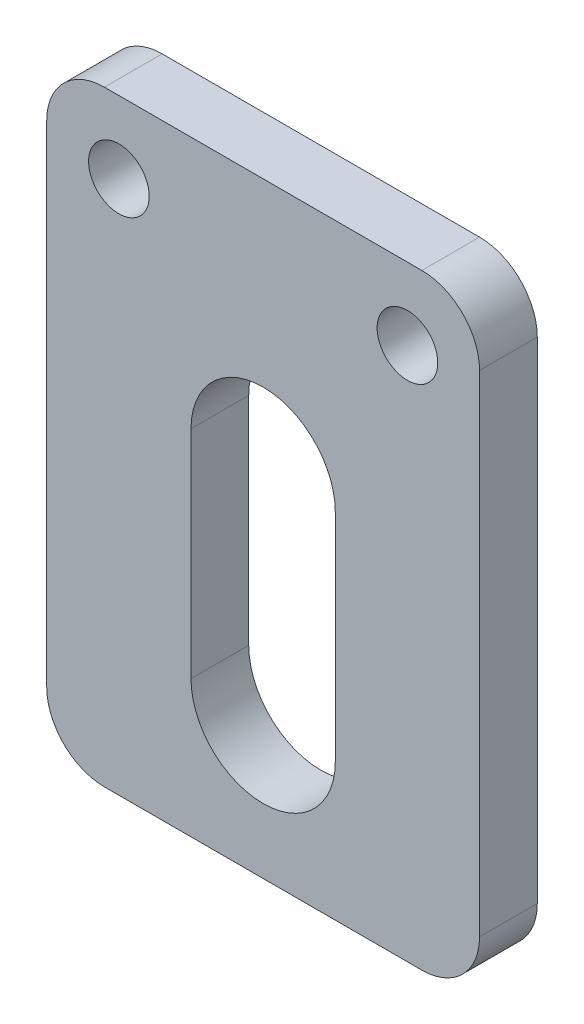
ISO-10303-21;
HEADER;
FILE_DESCRIPTION(('STEP AP214'),'2;1');
FILE_NAME('part.step','',(''),(''),'','','');
FILE_SCHEMA(('AUTOMOTIVE_DESIGN { 1 0 10303 214 1 1 1 1 }'));
ENDSEC;
DATA;
#1=APPLICATION_CONTEXT('core data for automotive mechanical design processes');
#2=APPLICATION_PROTOCOL_DEFINITION('international standard','automotive_design',2000,#1);
#3=PRODUCT_CONTEXT('',#1,'mechanical');
#4=PRODUCT('Part','Part','',(#3));
#5=PRODUCT_RELATED_PRODUCT_CATEGORY('part','',(#4));
#6=PRODUCT_DEFINITION_FORMATION('','',#4);
#7=PRODUCT_DEFINITION_CONTEXT('part definition',#1,'design');
#8=PRODUCT_DEFINITION('design','',#6,#7);
#9=PRODUCT_DEFINITION_SHAPE('','',#8);
#10=(LENGTH_UNIT() NAMED_UNIT(*) SI_UNIT(.MILLI.,.METRE.));
#11=(NAMED_UNIT(*) PLANE_ANGLE_UNIT() SI_UNIT($,.RADIAN.));
#12=(NAMED_UNIT(*) SI_UNIT($,.STERADIAN.) SOLID_ANGLE_UNIT());
#13=UNCERTAINTY_MEASURE_WITH_UNIT(LENGTH_MEASURE(1.E-05),#10,'distance_accuracy_value','');
#14=(GEOMETRIC_REPRESENTATION_CONTEXT(3) GLOBAL_UNCERTAINTY_ASSIGNED_CONTEXT((#13)) GLOBAL_UNIT_ASSIGNED_CONTEXT((#10,
#11,#12)) REPRESENTATION_CONTEXT('',''));
#15=CARTESIAN_POINT('',(0.,0.,0.));
#16=DIRECTION('',(0.,0.,1.));
#17=DIRECTION('',(1.,0.,0.));
#18=AXIS2_PLACEMENT_3D('',#15,#16,#17);
#19=CARTESIAN_POINT('',(0.,0.,4.));
#20=DIRECTION('',(1.,0.,0.));
#21=DIRECTION('',(0.,1.,0.));
#22=AXIS2_PLACEMENT_3D('',#19,#20,#21);
#23=PLANE('',#22);
#24=DIRECTION('',(0.,-1.,0.));
#25=VECTOR('',#24,1.);
#26=CARTESIAN_POINT('',(0.,0.,0.));
#27=LINE('',#26,#25);
#28=CARTESIAN_POINT('',(0.,-4.,0.));
#29=VERTEX_POINT('',#28);
#30=CARTESIAN_POINT('',(0.,-38.,0.));
#31=VERTEX_POINT('',#30);
#32=EDGE_CURVE('E184',#29,#31,#27,.T.);
#33=ORIENTED_EDGE('',*,*,#32,.T.);
#34=DIRECTION('',(0.,0.,-1.));
#35=VECTOR('',#34,1.);
#36=CARTESIAN_POINT('',(0.,-38.,4.));
#37=LINE('',#36,#35);
#38=CARTESIAN_POINT('',(0.,-38.,4.));
#39=VERTEX_POINT('',#38);
#40=EDGE_CURVE('E256',#31,#39,#37,.F.);
#41=ORIENTED_EDGE('',*,*,#40,.T.);
#42=DIRECTION('',(0.,-1.,0.));
#43=VECTOR('',#42,1.);
#44=CARTESIAN_POINT('',(0.,0.,4.));
#45=LINE('',#44,#43);
#46=CARTESIAN_POINT('',(0.,-4.,4.));
#47=VERTEX_POINT('',#46);
#48=EDGE_CURVE('E205',#47,#39,#45,.T.);
#49=ORIENTED_EDGE('',*,*,#48,.F.);
#50=DIRECTION('',(0.,0.,-1.));
#51=VECTOR('',#50,1.);
#52=CARTESIAN_POINT('',(0.,-4.,4.));
#53=LINE('',#52,#51);
#54=EDGE_CURVE('E252',#47,#29,#53,.T.);
#55=ORIENTED_EDGE('',*,*,#54,.T.);
#56=EDGE_LOOP('',(#33,#41,#49,#55));
#57=FACE_BOUND('',#56,.T.);
#58=ADVANCED_FACE('F42',(#57),#23,.F.);
#59=CARTESIAN_POINT('',(0.,-42.,4.));
#60=DIRECTION('',(0.,1.,0.));
#61=DIRECTION('',(0.,0.,1.));
#62=AXIS2_PLACEMENT_3D('',#59,#60,#61);
#63=PLANE('',#62);
#64=DIRECTION('',(1.,0.,0.));
#65=VECTOR('',#64,1.);
#66=CARTESIAN_POINT('',(0.,-42.,4.));
#67=LINE('',#66,#65);
#68=CARTESIAN_POINT('',(4.,-42.,4.));
#69=VERTEX_POINT('',#68);
#70=CARTESIAN_POINT('',(26.,-42.,4.));
#71=VERTEX_POINT('',#70);
#72=EDGE_CURVE('E209',#69,#71,#67,.T.);
#73=ORIENTED_EDGE('',*,*,#72,.F.);
#74=DIRECTION('',(0.,0.,-1.));
#75=VECTOR('',#74,1.);
#76=CARTESIAN_POINT('',(4.,-42.,4.));
#77=LINE('',#76,#75);
#78=CARTESIAN_POINT('',(4.,-42.,0.));
#79=VERTEX_POINT('',#78);
#80=EDGE_CURVE('E236',#69,#79,#77,.T.);
#81=ORIENTED_EDGE('',*,*,#80,.T.);
#82=DIRECTION('',(1.,0.,0.));
#83=VECTOR('',#82,1.);
#84=CARTESIAN_POINT('',(0.,-42.,0.));
#85=LINE('',#84,#83);
#86=CARTESIAN_POINT('',(26.,-42.,0.));
#87=VERTEX_POINT('',#86);
#88=EDGE_CURVE('E224',#79,#87,#85,.T.);
#89=ORIENTED_EDGE('',*,*,#88,.T.);
#90=DIRECTION('',(0.,0.,-1.));
#91=VECTOR('',#90,1.);
#92=CARTESIAN_POINT('',(26.,-42.,4.));
#93=LINE('',#92,#91);
#94=EDGE_CURVE('E220',#87,#71,#93,.F.);
#95=ORIENTED_EDGE('',*,*,#94,.T.);
#96=EDGE_LOOP('',(#73,#81,#89,#95));
#97=FACE_BOUND('',#96,.T.);
#98=ADVANCED_FACE('F306',(#97),#63,.F.);
#99=CARTESIAN_POINT('',(30.,0.,4.));
#100=DIRECTION('',(-1.,0.,0.));
#101=DIRECTION('',(0.,-1.,0.));
#102=AXIS2_PLACEMENT_3D('',#99,#100,#101);
#103=PLANE('',#102);
#104=DIRECTION('',(0.,1.,0.));
#105=VECTOR('',#104,1.);
#106=CARTESIAN_POINT('',(30.,0.,4.));
#107=LINE('',#106,#105);
#108=CARTESIAN_POINT('',(30.,-38.,4.));
#109=VERTEX_POINT('',#108);
#110=CARTESIAN_POINT('',(30.,-4.,4.));
#111=VERTEX_POINT('',#110);
#112=EDGE_CURVE('E214',#109,#111,#107,.T.);
#113=ORIENTED_EDGE('',*,*,#112,.F.);
#114=DIRECTION('',(0.,0.,-1.));
#115=VECTOR('',#114,1.);
#116=CARTESIAN_POINT('',(30.,-38.,4.));
#117=LINE('',#116,#115);
#118=CARTESIAN_POINT('',(30.,-38.,0.));
#119=VERTEX_POINT('',#118);
#120=EDGE_CURVE('E273',#109,#119,#117,.T.);
#121=ORIENTED_EDGE('',*,*,#120,.T.);
#122=DIRECTION('',(0.,1.,0.));
#123=VECTOR('',#122,1.);
#124=CARTESIAN_POINT('',(30.,0.,0.));
#125=LINE('',#124,#123);
#126=CARTESIAN_POINT('',(30.,-4.,0.));
#127=VERTEX_POINT('',#126);
#128=EDGE_CURVE('E228',#119,#127,#125,.T.);
#129=ORIENTED_EDGE('',*,*,#128,.T.);
#130=DIRECTION('',(0.,0.,-1.));
#131=VECTOR('',#130,1.);
#132=CARTESIAN_POINT('',(30.,-4.,4.));
#133=LINE('',#132,#131);
#134=EDGE_CURVE('E270',#127,#111,#133,.F.);
#135=ORIENTED_EDGE('',*,*,#134,.T.);
#136=EDGE_LOOP('',(#113,#121,#129,#135));
#137=FACE_BOUND('',#136,.T.);
#138=ADVANCED_FACE('F281',(#137),#103,.F.);
#139=CARTESIAN_POINT('',(0.,0.,4.));
#140=DIRECTION('',(0.,-1.,0.));
#141=DIRECTION('',(0.,0.,-1.));
#142=AXIS2_PLACEMENT_3D('',#139,#140,#141);
#143=PLANE('',#142);
#144=DIRECTION('',(-1.,0.,0.));
#145=VECTOR('',#144,1.);
#146=CARTESIAN_POINT('',(0.,0.,4.));
#147=LINE('',#146,#145);
#148=CARTESIAN_POINT('',(26.,0.,4.));
#149=VERTEX_POINT('',#148);
#150=CARTESIAN_POINT('',(4.,0.,4.));
#151=VERTEX_POINT('',#150);
#152=EDGE_CURVE('E217',#149,#151,#147,.T.);
#153=ORIENTED_EDGE('',*,*,#152,.F.);
#154=DIRECTION('',(0.,0.,-1.));
#155=VECTOR('',#154,1.);
#156=CARTESIAN_POINT('',(26.,0.,4.));
#157=LINE('',#156,#155);
#158=CARTESIAN_POINT('',(26.,0.,0.));
#159=VERTEX_POINT('',#158);
#160=EDGE_CURVE('E11',#149,#159,#157,.T.);
#161=ORIENTED_EDGE('',*,*,#160,.T.);
#162=DIRECTION('',(-1.,0.,0.));
#163=VECTOR('',#162,1.);
#164=CARTESIAN_POINT('',(0.,0.,0.));
#165=LINE('',#164,#163);
#166=CARTESIAN_POINT('',(4.,0.,0.));
#167=VERTEX_POINT('',#166);
#168=EDGE_CURVE('E210',#159,#167,#165,.T.);
#169=ORIENTED_EDGE('',*,*,#168,.T.);
#170=DIRECTION('',(0.,0.,-1.));
#171=VECTOR('',#170,1.);
#172=CARTESIAN_POINT('',(4.,0.,4.));
#173=LINE('',#172,#171);
#174=EDGE_CURVE('E51',#167,#151,#173,.F.);
#175=ORIENTED_EDGE('',*,*,#174,.T.);
#176=EDGE_LOOP('',(#153,#161,#169,#175));
#177=FACE_BOUND('',#176,.T.);
#178=ADVANCED_FACE('F291',(#177),#143,.F.);
#179=CARTESIAN_POINT('',(0.,0.,4.));
#180=DIRECTION('',(0.,0.,1.));
#181=DIRECTION('',(1.,0.,0.));
#182=AXIS2_PLACEMENT_3D('',#179,#180,#181);
#183=PLANE('',#182);
#184=CARTESIAN_POINT('',(15.,-17.5,4.));
#185=DIRECTION('',(0.,0.,1.));
#186=DIRECTION('',(1.,0.,0.));
#187=AXIS2_PLACEMENT_3D('',#184,#185,#186);
#188=CIRCLE('',#187,4.99999999999999);
#189=CARTESIAN_POINT('',(20.,-17.5,4.));
#190=VERTEX_POINT('',#189);
#191=CARTESIAN_POINT('',(10.,-17.5,4.));
#192=VERTEX_POINT('',#191);
#193=EDGE_CURVE('E140',#190,#192,#188,.T.);
#194=ORIENTED_EDGE('',*,*,#193,.F.);
#195=DIRECTION('',(0.,1.,0.));
#196=VECTOR('',#195,1.);
#197=CARTESIAN_POINT('',(20.,-17.5,4.));
#198=LINE('',#197,#196);
#199=CARTESIAN_POINT('',(20.,-32.5,4.));
#200=VERTEX_POINT('',#199);
#201=EDGE_CURVE('E161',#200,#190,#198,.T.);
#202=ORIENTED_EDGE('',*,*,#201,.F.);
#203=CARTESIAN_POINT('',(15.,-32.5,4.));
#204=DIRECTION('',(0.,0.,1.));
#205=DIRECTION('',(1.,0.,0.));
#206=AXIS2_PLACEMENT_3D('',#203,#204,#205);
#207=CIRCLE('',#206,4.99999999999999);
#208=CARTESIAN_POINT('',(10.,-32.5,4.));
#209=VERTEX_POINT('',#208);
#210=EDGE_CURVE('E165',#209,#200,#207,.T.);
#211=ORIENTED_EDGE('',*,*,#210,.F.);
#212=DIRECTION('',(0.,-1.,0.));
#213=VECTOR('',#212,1.);
#214=CARTESIAN_POINT('',(10.,-17.5,4.));
#215=LINE('',#214,#213);
#216=EDGE_CURVE('E174',#192,#209,#215,.T.);
#217=ORIENTED_EDGE('',*,*,#216,.F.);
#218=EDGE_LOOP('',(#194,#202,#211,#217));
#219=FACE_BOUND('',#218,.T.);
#220=CARTESIAN_POINT('',(5.,-5.,4.));
#221=DIRECTION('',(0.,0.,1.));
#222=DIRECTION('',(1.,0.,0.));
#223=AXIS2_PLACEMENT_3D('',#220,#221,#222);
#224=CIRCLE('',#223,2.1);
#225=CARTESIAN_POINT('',(7.1,-5.,4.));
#226=VERTEX_POINT('',#225);
#227=EDGE_CURVE('E175',#226,#226,#224,.T.);
#228=ORIENTED_EDGE('',*,*,#227,.F.);
#229=EDGE_LOOP('',(#228));
#230=FACE_BOUND('',#229,.T.);
#231=CARTESIAN_POINT('',(25.,-5.,4.));
#232=DIRECTION('',(0.,0.,1.));
#233=DIRECTION('',(1.,0.,0.));
#234=AXIS2_PLACEMENT_3D('',#231,#232,#233);
#235=CIRCLE('',#234,2.1);
#236=CARTESIAN_POINT('',(27.1,-5.,4.));
#237=VERTEX_POINT('',#236);
#238=EDGE_CURVE('E197',#237,#237,#235,.T.);
#239=ORIENTED_EDGE('',*,*,#238,.F.);
#240=EDGE_LOOP('',(#239));
#241=FACE_BOUND('',#240,.T.);
#242=ORIENTED_EDGE('',*,*,#48,.T.);
#243=CARTESIAN_POINT('',(4.,-38.,4.));
#244=DIRECTION('',(0.,0.,1.));
#245=DIRECTION('',(1.,0.,0.));
#246=AXIS2_PLACEMENT_3D('',#243,#244,#245);
#247=CIRCLE('',#246,4.);
#248=EDGE_CURVE('E267',#39,#69,#247,.T.);
#249=ORIENTED_EDGE('',*,*,#248,.T.);
#250=ORIENTED_EDGE('',*,*,#72,.T.);
#251=CARTESIAN_POINT('',(26.,-38.,4.));
#252=DIRECTION('',(0.,0.,1.));
#253=DIRECTION('',(1.,0.,0.));
#254=AXIS2_PLACEMENT_3D('',#251,#252,#253);
#255=CIRCLE('',#254,4.);
#256=EDGE_CURVE('E264',#71,#109,#255,.T.);
#257=ORIENTED_EDGE('',*,*,#256,.T.);
#258=ORIENTED_EDGE('',*,*,#112,.T.);
#259=CARTESIAN_POINT('',(26.,-4.,4.));
#260=DIRECTION('',(0.,0.,1.));
#261=DIRECTION('',(1.,0.,0.));
#262=AXIS2_PLACEMENT_3D('',#259,#260,#261);
#263=CIRCLE('',#262,4.);
#264=EDGE_CURVE('E64',#111,#149,#263,.T.);
#265=ORIENTED_EDGE('',*,*,#264,.T.);
#266=ORIENTED_EDGE('',*,*,#152,.T.);
#267=CARTESIAN_POINT('',(4.,-4.,4.));
#268=DIRECTION('',(0.,0.,1.));
#269=DIRECTION('',(1.,0.,0.));
#270=AXIS2_PLACEMENT_3D('',#267,#268,#269);
#271=CIRCLE('',#270,4.);
#272=EDGE_CURVE('E259',#151,#47,#271,.T.);
#273=ORIENTED_EDGE('',*,*,#272,.T.);
#274=EDGE_LOOP('',(#242,#249,#250,#257,#258,#265,#266,#273));
#275=FACE_BOUND('',#274,.T.);
#276=ADVANCED_FACE('F293',(#219,#230,#241,#275),#183,.T.);
#277=CARTESIAN_POINT('',(0.,0.,0.));
#278=DIRECTION('',(0.,0.,1.));
#279=DIRECTION('',(1.,0.,0.));
#280=AXIS2_PLACEMENT_3D('',#277,#278,#279);
#281=PLANE('',#280);
#282=DIRECTION('',(0.,1.,0.));
#283=VECTOR('',#282,1.);
#284=CARTESIAN_POINT('',(20.,-17.5,0.));
#285=LINE('',#284,#283);
#286=CARTESIAN_POINT('',(20.,-32.5,0.));
#287=VERTEX_POINT('',#286);
#288=CARTESIAN_POINT('',(20.,-17.5,0.));
#289=VERTEX_POINT('',#288);
#290=EDGE_CURVE('E146',#287,#289,#285,.T.);
#291=ORIENTED_EDGE('',*,*,#290,.T.);
#292=CARTESIAN_POINT('',(15.,-17.5,0.));
#293=DIRECTION('',(0.,0.,1.));
#294=DIRECTION('',(1.,0.,0.));
#295=AXIS2_PLACEMENT_3D('',#292,#293,#294);
#296=CIRCLE('',#295,4.99999999999999);
#297=CARTESIAN_POINT('',(10.,-17.5,0.));
#298=VERTEX_POINT('',#297);
#299=EDGE_CURVE('E137',#289,#298,#296,.T.);
#300=ORIENTED_EDGE('',*,*,#299,.T.);
#301=DIRECTION('',(0.,-1.,0.));
#302=VECTOR('',#301,1.);
#303=CARTESIAN_POINT('',(10.,-17.5,0.));
#304=LINE('',#303,#302);
#305=CARTESIAN_POINT('',(10.,-32.5,0.));
#306=VERTEX_POINT('',#305);
#307=EDGE_CURVE('E150',#298,#306,#304,.T.);
#308=ORIENTED_EDGE('',*,*,#307,.T.);
#309=CARTESIAN_POINT('',(15.,-32.5,0.));
#310=DIRECTION('',(0.,0.,1.));
#311=DIRECTION('',(1.,0.,0.));
#312=AXIS2_PLACEMENT_3D('',#309,#310,#311);
#313=CIRCLE('',#312,4.99999999999999);
#314=EDGE_CURVE('E155',#306,#287,#313,.T.);
#315=ORIENTED_EDGE('',*,*,#314,.T.);
#316=EDGE_LOOP('',(#291,#300,#308,#315));
#317=FACE_BOUND('',#316,.T.);
#318=CARTESIAN_POINT('',(5.,-5.,0.));
#319=DIRECTION('',(0.,0.,1.));
#320=DIRECTION('',(1.,0.,0.));
#321=AXIS2_PLACEMENT_3D('',#318,#319,#320);
#322=CIRCLE('',#321,2.1);
#323=CARTESIAN_POINT('',(7.1,-5.,0.));
#324=VERTEX_POINT('',#323);
#325=EDGE_CURVE('E193',#324,#324,#322,.T.);
#326=ORIENTED_EDGE('',*,*,#325,.T.);
#327=EDGE_LOOP('',(#326));
#328=FACE_BOUND('',#327,.T.);
#329=CARTESIAN_POINT('',(25.,-5.,0.));
#330=DIRECTION('',(0.,0.,1.));
#331=DIRECTION('',(1.,0.,0.));
#332=AXIS2_PLACEMENT_3D('',#329,#330,#331);
#333=CIRCLE('',#332,2.1);
#334=CARTESIAN_POINT('',(27.1,-5.,0.));
#335=VERTEX_POINT('',#334);
#336=EDGE_CURVE('E201',#335,#335,#333,.T.);
#337=ORIENTED_EDGE('',*,*,#336,.T.);
#338=EDGE_LOOP('',(#337));
#339=FACE_BOUND('',#338,.T.);
#340=ORIENTED_EDGE('',*,*,#88,.F.);
#341=CARTESIAN_POINT('',(4.,-38.,0.));
#342=DIRECTION('',(0.,0.,1.));
#343=DIRECTION('',(1.,0.,0.));
#344=AXIS2_PLACEMENT_3D('',#341,#342,#343);
#345=CIRCLE('',#344,4.);
#346=EDGE_CURVE('E249',#79,#31,#345,.F.);
#347=ORIENTED_EDGE('',*,*,#346,.T.);
#348=ORIENTED_EDGE('',*,*,#32,.F.);
#349=CARTESIAN_POINT('',(4.,-4.,0.));
#350=DIRECTION('',(0.,0.,1.));
#351=DIRECTION('',(1.,0.,0.));
#352=AXIS2_PLACEMENT_3D('',#349,#350,#351);
#353=CIRCLE('',#352,4.);
#354=EDGE_CURVE('E240',#29,#167,#353,.F.);
#355=ORIENTED_EDGE('',*,*,#354,.T.);
#356=ORIENTED_EDGE('',*,*,#168,.F.);
#357=CARTESIAN_POINT('',(26.,-4.,0.));
#358=DIRECTION('',(0.,0.,1.));
#359=DIRECTION('',(1.,0.,0.));
#360=AXIS2_PLACEMENT_3D('',#357,#358,#359);
#361=CIRCLE('',#360,4.);
#362=EDGE_CURVE('E243',#159,#127,#361,.F.);
#363=ORIENTED_EDGE('',*,*,#362,.T.);
#364=ORIENTED_EDGE('',*,*,#128,.F.);
#365=CARTESIAN_POINT('',(26.,-38.,0.));
#366=DIRECTION('',(0.,0.,1.));
#367=DIRECTION('',(1.,0.,0.));
#368=AXIS2_PLACEMENT_3D('',#365,#366,#367);
#369=CIRCLE('',#368,4.);
#370=EDGE_CURVE('E246',#119,#87,#369,.F.);
#371=ORIENTED_EDGE('',*,*,#370,.T.);
#372=EDGE_LOOP('',(#340,#347,#348,#355,#356,#363,#364,#371));
#373=FACE_BOUND('',#372,.T.);
#374=ADVANCED_FACE('F157',(#317,#328,#339,#373),#281,.F.);
#375=CARTESIAN_POINT('',(25.,-5.,0.));
#376=DIRECTION('',(0.,0.,1.));
#377=DIRECTION('',(1.,0.,0.));
#378=AXIS2_PLACEMENT_3D('',#375,#376,#377);
#379=CYLINDRICAL_SURFACE('',#378,2.1);
#380=ORIENTED_EDGE('',*,*,#336,.F.);
#381=EDGE_LOOP('',(#380));
#382=FACE_BOUND('',#381,.T.);
#383=ORIENTED_EDGE('',*,*,#238,.T.);
#384=EDGE_LOOP('',(#383));
#385=FACE_BOUND('',#384,.T.);
#386=ADVANCED_FACE('F329',(#382,#385),#379,.F.);
#387=CARTESIAN_POINT('',(5.,-5.,0.));
#388=DIRECTION('',(0.,0.,1.));
#389=DIRECTION('',(1.,0.,0.));
#390=AXIS2_PLACEMENT_3D('',#387,#388,#389);
#391=CYLINDRICAL_SURFACE('',#390,2.1);
#392=ORIENTED_EDGE('',*,*,#325,.F.);
#393=EDGE_LOOP('',(#392));
#394=FACE_BOUND('',#393,.T.);
#395=ORIENTED_EDGE('',*,*,#227,.T.);
#396=EDGE_LOOP('',(#395));
#397=FACE_BOUND('',#396,.T.);
#398=ADVANCED_FACE('F335',(#394,#397),#391,.F.);
#399=CARTESIAN_POINT('',(15.,-17.5,0.));
#400=DIRECTION('',(0.,0.,1.));
#401=DIRECTION('',(1.,0.,0.));
#402=AXIS2_PLACEMENT_3D('',#399,#400,#401);
#403=CYLINDRICAL_SURFACE('',#402,4.99999999999999);
#404=ORIENTED_EDGE('',*,*,#193,.T.);
#405=DIRECTION('',(0.,0.,1.));
#406=VECTOR('',#405,1.);
#407=CARTESIAN_POINT('',(10.,-17.5,0.));
#408=LINE('',#407,#406);
#409=EDGE_CURVE('E133',#298,#192,#408,.T.);
#410=ORIENTED_EDGE('',*,*,#409,.F.);
#411=ORIENTED_EDGE('',*,*,#299,.F.);
#412=DIRECTION('',(0.,0.,1.));
#413=VECTOR('',#412,1.);
#414=CARTESIAN_POINT('',(20.,-17.5,0.));
#415=LINE('',#414,#413);
#416=EDGE_CURVE('E181',#289,#190,#415,.T.);
#417=ORIENTED_EDGE('',*,*,#416,.T.);
#418=EDGE_LOOP('',(#404,#410,#411,#417));
#419=FACE_BOUND('',#418,.T.);
#420=ADVANCED_FACE('F135',(#419),#403,.F.);
#421=CARTESIAN_POINT('',(20.,-17.5,0.));
#422=DIRECTION('',(1.,0.,0.));
#423=DIRECTION('',(0.,1.,0.));
#424=AXIS2_PLACEMENT_3D('',#421,#422,#423);
#425=PLANE('',#424);
#426=ORIENTED_EDGE('',*,*,#201,.T.);
#427=ORIENTED_EDGE('',*,*,#416,.F.);
#428=ORIENTED_EDGE('',*,*,#290,.F.);
#429=DIRECTION('',(0.,0.,1.));
#430=VECTOR('',#429,1.);
#431=CARTESIAN_POINT('',(20.,-32.5,0.));
#432=LINE('',#431,#430);
#433=EDGE_CURVE('E185',#287,#200,#432,.T.);
#434=ORIENTED_EDGE('',*,*,#433,.T.);
#435=EDGE_LOOP('',(#426,#427,#428,#434));
#436=FACE_BOUND('',#435,.T.);
#437=ADVANCED_FACE('F342',(#436),#425,.F.);
#438=CARTESIAN_POINT('',(15.,-32.5,0.));
#439=DIRECTION('',(0.,0.,1.));
#440=DIRECTION('',(1.,0.,0.));
#441=AXIS2_PLACEMENT_3D('',#438,#439,#440);
#442=CYLINDRICAL_SURFACE('',#441,4.99999999999999);
#443=ORIENTED_EDGE('',*,*,#210,.T.);
#444=ORIENTED_EDGE('',*,*,#433,.F.);
#445=ORIENTED_EDGE('',*,*,#314,.F.);
#446=DIRECTION('',(0.,0.,1.));
#447=VECTOR('',#446,1.);
#448=CARTESIAN_POINT('',(10.,-32.5,0.));
#449=LINE('',#448,#447);
#450=EDGE_CURVE('E145',#306,#209,#449,.T.);
#451=ORIENTED_EDGE('',*,*,#450,.T.);
#452=EDGE_LOOP('',(#443,#444,#445,#451));
#453=FACE_BOUND('',#452,.T.);
#454=ADVANCED_FACE('F345',(#453),#442,.F.);
#455=CARTESIAN_POINT('',(10.,-17.5,0.));
#456=DIRECTION('',(-1.,0.,0.));
#457=DIRECTION('',(0.,-1.,0.));
#458=AXIS2_PLACEMENT_3D('',#455,#456,#457);
#459=PLANE('',#458);
#460=ORIENTED_EDGE('',*,*,#216,.T.);
#461=ORIENTED_EDGE('',*,*,#450,.F.);
#462=ORIENTED_EDGE('',*,*,#307,.F.);
#463=ORIENTED_EDGE('',*,*,#409,.T.);
#464=EDGE_LOOP('',(#460,#461,#462,#463));
#465=FACE_BOUND('',#464,.T.);
#466=ADVANCED_FACE('F151',(#465),#459,.F.);
#467=CARTESIAN_POINT('',(4.,-38.,4.));
#468=DIRECTION('',(0.,0.,-1.));
#469=DIRECTION('',(-1.,0.,0.));
#470=AXIS2_PLACEMENT_3D('',#467,#468,#469);
#471=CYLINDRICAL_SURFACE('',#470,4.);
#472=ORIENTED_EDGE('',*,*,#248,.F.);
#473=ORIENTED_EDGE('',*,*,#40,.F.);
#474=ORIENTED_EDGE('',*,*,#346,.F.);
#475=ORIENTED_EDGE('',*,*,#80,.F.);
#476=EDGE_LOOP('',(#472,#473,#474,#475));
#477=FACE_BOUND('',#476,.T.);
#478=ADVANCED_FACE('F303',(#477),#471,.T.);
#479=CARTESIAN_POINT('',(26.,-38.,4.));
#480=DIRECTION('',(0.,0.,-1.));
#481=DIRECTION('',(-1.,0.,0.));
#482=AXIS2_PLACEMENT_3D('',#479,#480,#481);
#483=CYLINDRICAL_SURFACE('',#482,4.);
#484=ORIENTED_EDGE('',*,*,#256,.F.);
#485=ORIENTED_EDGE('',*,*,#94,.F.);
#486=ORIENTED_EDGE('',*,*,#370,.F.);
#487=ORIENTED_EDGE('',*,*,#120,.F.);
#488=EDGE_LOOP('',(#484,#485,#486,#487));
#489=FACE_BOUND('',#488,.T.);
#490=ADVANCED_FACE('F308',(#489),#483,.T.);
#491=CARTESIAN_POINT('',(26.,-4.,4.));
#492=DIRECTION('',(0.,0.,-1.));
#493=DIRECTION('',(-1.,0.,0.));
#494=AXIS2_PLACEMENT_3D('',#491,#492,#493);
#495=CYLINDRICAL_SURFACE('',#494,4.);
#496=ORIENTED_EDGE('',*,*,#264,.F.);
#497=ORIENTED_EDGE('',*,*,#134,.F.);
#498=ORIENTED_EDGE('',*,*,#362,.F.);
#499=ORIENTED_EDGE('',*,*,#160,.F.);
#500=EDGE_LOOP('',(#496,#497,#498,#499));
#501=FACE_BOUND('',#500,.T.);
#502=ADVANCED_FACE('F290',(#501),#495,.T.);
#503=CARTESIAN_POINT('',(4.,-4.,4.));
#504=DIRECTION('',(0.,0.,-1.));
#505=DIRECTION('',(-1.,0.,0.));
#506=AXIS2_PLACEMENT_3D('',#503,#504,#505);
#507=CYLINDRICAL_SURFACE('',#506,4.);
#508=ORIENTED_EDGE('',*,*,#272,.F.);
#509=ORIENTED_EDGE('',*,*,#174,.F.);
#510=ORIENTED_EDGE('',*,*,#354,.F.);
#511=ORIENTED_EDGE('',*,*,#54,.F.);
#512=EDGE_LOOP('',(#508,#509,#510,#511));
#513=FACE_BOUND('',#512,.T.);
#514=ADVANCED_FACE('F44',(#513),#507,.T.);
#515=CLOSED_SHELL('',(#58,#98,#138,#178,#276,#374,#386,#398,#420,#437,#454,#466,#478,#490,#502,#514));
#516=MANIFOLD_SOLID_BREP('B2',#515);
#517=ADVANCED_BREP_SHAPE_REPRESENTATION('',(#18,#516),#14);
#518=SHAPE_DEFINITION_REPRESENTATION(#9,#517);
ENDSEC;
END-ISO-10303-21;
